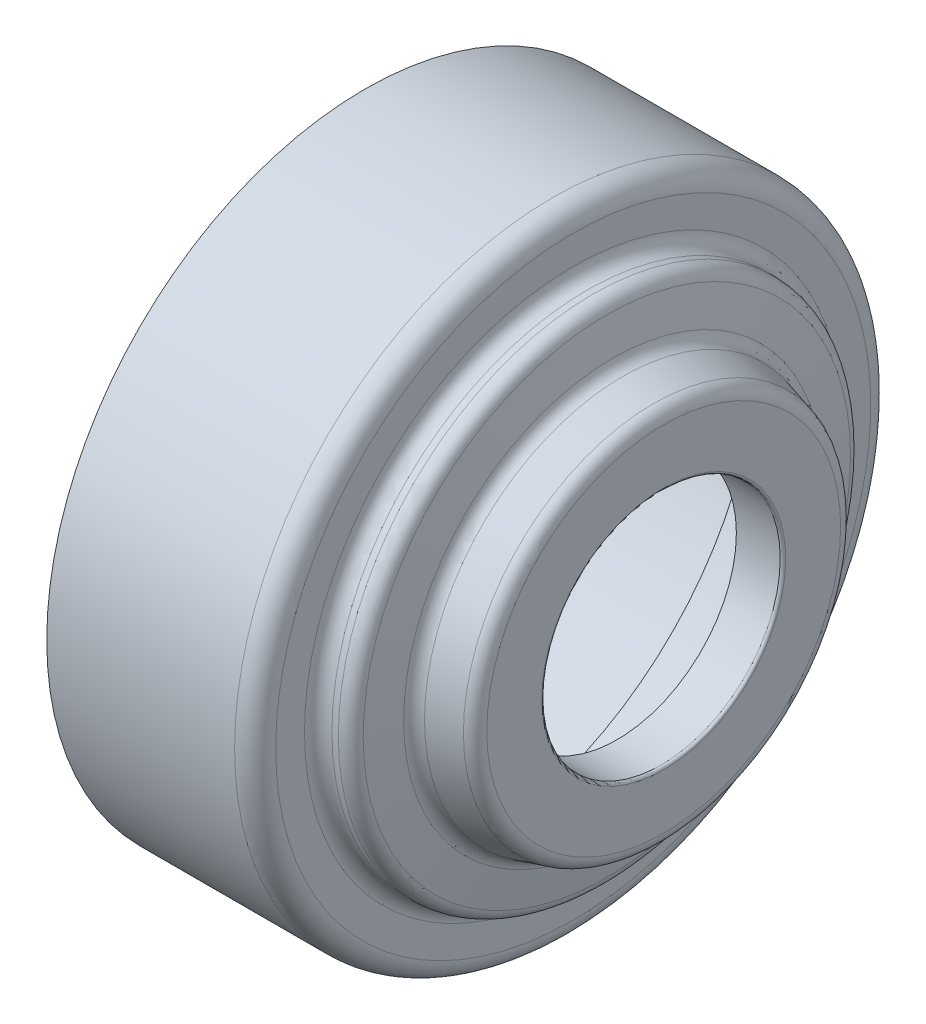
ISO-10303-21;
HEADER;
FILE_DESCRIPTION(('STEP AP214'),'2;1');
FILE_NAME('part.step','',(''),(''),'','','');
FILE_SCHEMA(('AUTOMOTIVE_DESIGN { 1 0 10303 214 1 1 1 1 }'));
ENDSEC;
DATA;
#1=APPLICATION_CONTEXT('core data for automotive mechanical design processes');
#2=APPLICATION_PROTOCOL_DEFINITION('international standard','automotive_design',2000,#1);
#3=PRODUCT_CONTEXT('',#1,'mechanical');
#4=PRODUCT('Part','Part','',(#3));
#5=PRODUCT_RELATED_PRODUCT_CATEGORY('part','',(#4));
#6=PRODUCT_DEFINITION_FORMATION('','',#4);
#7=PRODUCT_DEFINITION_CONTEXT('part definition',#1,'design');
#8=PRODUCT_DEFINITION('design','',#6,#7);
#9=PRODUCT_DEFINITION_SHAPE('','',#8);
#10=(LENGTH_UNIT() NAMED_UNIT(*) SI_UNIT(.MILLI.,.METRE.));
#11=(NAMED_UNIT(*) PLANE_ANGLE_UNIT() SI_UNIT($,.RADIAN.));
#12=(NAMED_UNIT(*) SI_UNIT($,.STERADIAN.) SOLID_ANGLE_UNIT());
#13=UNCERTAINTY_MEASURE_WITH_UNIT(LENGTH_MEASURE(1.E-05),#10,'distance_accuracy_value','');
#14=(GEOMETRIC_REPRESENTATION_CONTEXT(3) GLOBAL_UNCERTAINTY_ASSIGNED_CONTEXT((#13)) GLOBAL_UNIT_ASSIGNED_CONTEXT((#10,
#11,#12)) REPRESENTATION_CONTEXT('',''));
#15=CARTESIAN_POINT('',(0.,0.,0.));
#16=DIRECTION('',(0.,0.,1.));
#17=DIRECTION('',(1.,0.,0.));
#18=AXIS2_PLACEMENT_3D('',#15,#16,#17);
#19=CARTESIAN_POINT('',(-14.,22.,0.));
#20=DIRECTION('',(1.,0.,0.));
#21=DIRECTION('',(0.,0.,-1.));
#22=AXIS2_PLACEMENT_3D('',#19,#20,#21);
#23=PLANE('',#22);
#24=CARTESIAN_POINT('',(-14.,0.,0.));
#25=DIRECTION('',(-1.,0.,0.));
#26=DIRECTION('',(0.,0.,1.));
#27=AXIS2_PLACEMENT_3D('',#24,#25,#26);
#28=CIRCLE('',#27,22.);
#29=CARTESIAN_POINT('',(-14.,0.,22.));
#30=VERTEX_POINT('',#29);
#31=EDGE_CURVE('E127',#30,#30,#28,.T.);
#32=ORIENTED_EDGE('',*,*,#31,.F.);
#33=EDGE_LOOP('',(#32));
#34=FACE_BOUND('',#33,.T.);
#35=CARTESIAN_POINT('',(-14.,0.,0.));
#36=DIRECTION('',(-1.,0.,0.));
#37=DIRECTION('',(0.,0.,1.));
#38=AXIS2_PLACEMENT_3D('',#35,#36,#37);
#39=CIRCLE('',#38,23.2);
#40=CARTESIAN_POINT('',(-14.,0.,23.2));
#41=VERTEX_POINT('',#40);
#42=EDGE_CURVE('E109',#41,#41,#39,.T.);
#43=ORIENTED_EDGE('',*,*,#42,.T.);
#44=EDGE_LOOP('',(#43));
#45=FACE_BOUND('',#44,.T.);
#46=ADVANCED_FACE('F35',(#34,#45),#23,.F.);
#47=CARTESIAN_POINT('',(-36.9366053169734,0.,0.));
#48=DIRECTION('',(-1.,0.,0.));
#49=DIRECTION('',(0.,0.,1.));
#50=AXIS2_PLACEMENT_3D('',#47,#48,#49);
#51=CYLINDRICAL_SURFACE('',#50,23.2);
#52=CARTESIAN_POINT('',(-0.300000000000002,0.,0.));
#53=DIRECTION('',(-1.,0.,0.));
#54=DIRECTION('',(0.,0.,1.));
#55=AXIS2_PLACEMENT_3D('',#52,#53,#54);
#56=CIRCLE('',#55,23.2);
#57=CARTESIAN_POINT('',(-0.300000000000002,0.,23.2));
#58=VERTEX_POINT('',#57);
#59=EDGE_CURVE('E50',#58,#58,#56,.T.);
#60=ORIENTED_EDGE('',*,*,#59,.T.);
#61=EDGE_LOOP('',(#60));
#62=FACE_BOUND('',#61,.T.);
#63=ORIENTED_EDGE('',*,*,#42,.F.);
#64=EDGE_LOOP('',(#63));
#65=FACE_BOUND('',#64,.T.);
#66=ADVANCED_FACE('F135',(#62,#65),#51,.T.);
#67=CARTESIAN_POINT('',(1.2,23.2,0.));
#68=DIRECTION('',(-1.,0.,0.));
#69=DIRECTION('',(0.,0.,1.));
#70=AXIS2_PLACEMENT_3D('',#67,#68,#69);
#71=PLANE('',#70);
#72=CARTESIAN_POINT('',(1.2,0.,0.));
#73=DIRECTION('',(-1.,0.,0.));
#74=DIRECTION('',(0.,0.,1.));
#75=AXIS2_PLACEMENT_3D('',#72,#73,#74);
#76=CIRCLE('',#75,21.7);
#77=CARTESIAN_POINT('',(1.2,0.,21.7));
#78=VERTEX_POINT('',#77);
#79=EDGE_CURVE('E46',#78,#78,#76,.F.);
#80=ORIENTED_EDGE('',*,*,#79,.T.);
#81=EDGE_LOOP('',(#80));
#82=FACE_BOUND('',#81,.T.);
#83=CARTESIAN_POINT('',(1.2,0.,0.));
#84=DIRECTION('',(-1.,0.,0.));
#85=DIRECTION('',(0.,0.,1.));
#86=AXIS2_PLACEMENT_3D('',#83,#84,#85);
#87=CIRCLE('',#86,19.6);
#88=CARTESIAN_POINT('',(1.2,0.,19.6));
#89=VERTEX_POINT('',#88);
#90=EDGE_CURVE('E67',#89,#89,#87,.T.);
#91=ORIENTED_EDGE('',*,*,#90,.T.);
#92=EDGE_LOOP('',(#91));
#93=FACE_BOUND('',#92,.T.);
#94=ADVANCED_FACE('F140',(#82,#93),#71,.F.);
#95=CARTESIAN_POINT('',(-36.9366053169734,0.,0.));
#96=DIRECTION('',(-1.,0.,0.));
#97=DIRECTION('',(0.,0.,1.));
#98=AXIS2_PLACEMENT_3D('',#95,#96,#97);
#99=CYLINDRICAL_SURFACE('',#98,18.6);
#100=CARTESIAN_POINT('',(2.2,0.,0.));
#101=DIRECTION('',(-1.,0.,0.));
#102=DIRECTION('',(0.,0.,1.));
#103=AXIS2_PLACEMENT_3D('',#100,#101,#102);
#104=CIRCLE('',#103,18.6);
#105=CARTESIAN_POINT('',(2.2,0.,18.6));
#106=VERTEX_POINT('',#105);
#107=EDGE_CURVE('E61',#106,#106,#104,.F.);
#108=ORIENTED_EDGE('',*,*,#107,.T.);
#109=EDGE_LOOP('',(#108));
#110=FACE_BOUND('',#109,.T.);
#111=CARTESIAN_POINT('',(2.66781992623546,0.,0.));
#112=DIRECTION('',(1.,0.,0.));
#113=DIRECTION('',(0.,0.,-1.));
#114=AXIS2_PLACEMENT_3D('',#111,#112,#113);
#115=CIRCLE('',#114,18.6);
#116=CARTESIAN_POINT('',(2.66781992623546,0.,-18.6));
#117=VERTEX_POINT('',#116);
#118=EDGE_CURVE('E64',#117,#117,#115,.F.);
#119=ORIENTED_EDGE('',*,*,#118,.T.);
#120=EDGE_LOOP('',(#119));
#121=FACE_BOUND('',#120,.T.);
#122=ADVANCED_FACE('F146',(#110,#121),#99,.T.);
#123=CARTESIAN_POINT('',(4.20628056986992,0.,0.));
#124=DIRECTION('',(-1.,0.,0.));
#125=DIRECTION('',(0.,0.,1.));
#126=AXIS2_PLACEMENT_3D('',#123,#124,#125);
#127=CONICAL_SURFACE('',#126,14.6337266047022,1.39626340159546);
#128=CARTESIAN_POINT('',(3.65262767924767,0.,0.));
#129=DIRECTION('',(1.,0.,0.));
#130=DIRECTION('',(0.,0.,-1.));
#131=AXIS2_PLACEMENT_3D('',#128,#129,#130);
#132=CIRCLE('',#131,17.7736481776669);
#133=CARTESIAN_POINT('',(3.65262767924767,0.,-17.7736481776669));
#134=VERTEX_POINT('',#133);
#135=EDGE_CURVE('E55',#134,#134,#132,.T.);
#136=ORIENTED_EDGE('',*,*,#135,.T.);
#137=EDGE_LOOP('',(#136));
#138=FACE_BOUND('',#137,.T.);
#139=CARTESIAN_POINT('',(4.0956544800349,0.,0.));
#140=DIRECTION('',(-1.,0.,0.));
#141=DIRECTION('',(0.,0.,1.));
#142=AXIS2_PLACEMENT_3D('',#139,#140,#141);
#143=CIRCLE('',#142,15.2611183367589);
#144=CARTESIAN_POINT('',(4.0956544800349,0.,15.2611183367589));
#145=VERTEX_POINT('',#144);
#146=EDGE_CURVE('E58',#145,#145,#143,.T.);
#147=ORIENTED_EDGE('',*,*,#146,.T.);
#148=EDGE_LOOP('',(#147));
#149=FACE_BOUND('',#148,.T.);
#150=ADVANCED_FACE('F291',(#138,#149),#127,.T.);
#151=CARTESIAN_POINT('',(7.8,0.,0.));
#152=DIRECTION('',(-1.,0.,0.));
#153=DIRECTION('',(0.,0.,1.));
#154=AXIS2_PLACEMENT_3D('',#151,#152,#153);
#155=CONICAL_SURFACE('',#154,13.6707923855747,0.261799387799154);
#156=CARTESIAN_POINT('',(7.05881904510253,0.,0.));
#157=DIRECTION('',(1.,0.,0.));
#158=DIRECTION('',(0.,0.,-1.));
#159=AXIS2_PLACEMENT_3D('',#156,#157,#158);
#160=CIRCLE('',#159,13.8693912238849);
#161=CARTESIAN_POINT('',(7.05881904510253,0.,-13.8693912238849));
#162=VERTEX_POINT('',#161);
#163=EDGE_CURVE('E73',#162,#162,#160,.F.);
#164=ORIENTED_EDGE('',*,*,#163,.T.);
#165=EDGE_LOOP('',(#164));
#166=FACE_BOUND('',#165,.T.);
#167=CARTESIAN_POINT('',(4.82164318794459,0.,0.));
#168=DIRECTION('',(-1.,0.,0.));
#169=DIRECTION('',(0.,0.,1.));
#170=AXIS2_PLACEMENT_3D('',#167,#168,#169);
#171=CIRCLE('',#170,14.4688406881367);
#172=CARTESIAN_POINT('',(4.82164318794459,0.,14.4688406881367));
#173=VERTEX_POINT('',#172);
#174=EDGE_CURVE('E76',#173,#173,#171,.F.);
#175=ORIENTED_EDGE('',*,*,#174,.T.);
#176=EDGE_LOOP('',(#175));
#177=FACE_BOUND('',#176,.T.);
#178=ADVANCED_FACE('F279',(#166,#177),#155,.T.);
#179=CARTESIAN_POINT('',(7.8,13.6707923855747,0.));
#180=DIRECTION('',(-1.,0.,0.));
#181=DIRECTION('',(0.,0.,1.));
#182=AXIS2_PLACEMENT_3D('',#179,#180,#181);
#183=PLANE('',#182);
#184=CARTESIAN_POINT('',(7.8,0.,0.));
#185=DIRECTION('',(-1.,0.,0.));
#186=DIRECTION('',(0.,0.,1.));
#187=AXIS2_PLACEMENT_3D('',#184,#185,#186);
#188=CIRCLE('',#187,12.9034653975958);
#189=CARTESIAN_POINT('',(7.8,0.,12.9034653975958));
#190=VERTEX_POINT('',#189);
#191=EDGE_CURVE('E70',#190,#190,#188,.F.);
#192=ORIENTED_EDGE('',*,*,#191,.T.);
#193=EDGE_LOOP('',(#192));
#194=FACE_BOUND('',#193,.T.);
#195=CARTESIAN_POINT('',(7.8,0.,0.));
#196=DIRECTION('',(-1.,0.,0.));
#197=DIRECTION('',(0.,0.,1.));
#198=AXIS2_PLACEMENT_3D('',#195,#196,#197);
#199=CIRCLE('',#198,8.9);
#200=CARTESIAN_POINT('',(7.8,0.,8.9));
#201=VERTEX_POINT('',#200);
#202=EDGE_CURVE('E100',#201,#201,#199,.T.);
#203=ORIENTED_EDGE('',*,*,#202,.T.);
#204=EDGE_LOOP('',(#203));
#205=FACE_BOUND('',#204,.T.);
#206=ADVANCED_FACE('F273',(#194,#205),#183,.F.);
#207=CARTESIAN_POINT('',(-36.9366053169734,0.,0.));
#208=DIRECTION('',(-1.,0.,0.));
#209=DIRECTION('',(0.,0.,1.));
#210=AXIS2_PLACEMENT_3D('',#207,#208,#209);
#211=CYLINDRICAL_SURFACE('',#210,8.7);
#212=CARTESIAN_POINT('',(7.6,0.,0.));
#213=DIRECTION('',(-1.,0.,0.));
#214=DIRECTION('',(0.,0.,1.));
#215=AXIS2_PLACEMENT_3D('',#212,#213,#214);
#216=CIRCLE('',#215,8.7);
#217=CARTESIAN_POINT('',(7.6,0.,8.7));
#218=VERTEX_POINT('',#217);
#219=EDGE_CURVE('E97',#218,#218,#216,.F.);
#220=ORIENTED_EDGE('',*,*,#219,.T.);
#221=EDGE_LOOP('',(#220));
#222=FACE_BOUND('',#221,.T.);
#223=CARTESIAN_POINT('',(4.4,0.,0.));
#224=DIRECTION('',(-1.,0.,0.));
#225=DIRECTION('',(0.,0.,1.));
#226=AXIS2_PLACEMENT_3D('',#223,#224,#225);
#227=CIRCLE('',#226,8.7);
#228=CARTESIAN_POINT('',(4.4,0.,8.7));
#229=VERTEX_POINT('',#228);
#230=EDGE_CURVE('E112',#229,#229,#227,.T.);
#231=ORIENTED_EDGE('',*,*,#230,.T.);
#232=EDGE_LOOP('',(#231));
#233=FACE_BOUND('',#232,.T.);
#234=ADVANCED_FACE('F278',(#222,#233),#211,.F.);
#235=CARTESIAN_POINT('',(4.4,9.4,0.));
#236=DIRECTION('',(1.,0.,0.));
#237=DIRECTION('',(0.,0.,-1.));
#238=AXIS2_PLACEMENT_3D('',#235,#236,#237);
#239=PLANE('',#238);
#240=ORIENTED_EDGE('',*,*,#230,.F.);
#241=EDGE_LOOP('',(#240));
#242=FACE_BOUND('',#241,.T.);
#243=CARTESIAN_POINT('',(4.4,0.,0.));
#244=DIRECTION('',(-1.,0.,0.));
#245=DIRECTION('',(0.,0.,1.));
#246=AXIS2_PLACEMENT_3D('',#243,#244,#245);
#247=CIRCLE('',#246,9.4);
#248=CARTESIAN_POINT('',(4.4,0.,9.4));
#249=VERTEX_POINT('',#248);
#250=EDGE_CURVE('E115',#249,#249,#247,.T.);
#251=ORIENTED_EDGE('',*,*,#250,.T.);
#252=EDGE_LOOP('',(#251));
#253=FACE_BOUND('',#252,.T.);
#254=ADVANCED_FACE('F385',(#242,#253),#239,.F.);
#255=CARTESIAN_POINT('',(-36.9366053169734,0.,0.));
#256=DIRECTION('',(-1.,0.,0.));
#257=DIRECTION('',(0.,0.,1.));
#258=AXIS2_PLACEMENT_3D('',#255,#256,#257);
#259=CYLINDRICAL_SURFACE('',#258,9.4);
#260=ORIENTED_EDGE('',*,*,#250,.F.);
#261=EDGE_LOOP('',(#260));
#262=FACE_BOUND('',#261,.T.);
#263=CARTESIAN_POINT('',(6.6,0.,0.));
#264=DIRECTION('',(-1.,0.,0.));
#265=DIRECTION('',(0.,0.,1.));
#266=AXIS2_PLACEMENT_3D('',#263,#264,#265);
#267=CIRCLE('',#266,9.4);
#268=CARTESIAN_POINT('',(6.6,0.,9.4));
#269=VERTEX_POINT('',#268);
#270=EDGE_CURVE('E118',#269,#269,#267,.T.);
#271=ORIENTED_EDGE('',*,*,#270,.T.);
#272=EDGE_LOOP('',(#271));
#273=FACE_BOUND('',#272,.T.);
#274=ADVANCED_FACE('F375',(#262,#273),#259,.T.);
#275=CARTESIAN_POINT('',(6.6,12.75,0.));
#276=DIRECTION('',(1.,0.,0.));
#277=DIRECTION('',(0.,0.,-1.));
#278=AXIS2_PLACEMENT_3D('',#275,#276,#277);
#279=PLANE('',#278);
#280=CARTESIAN_POINT('',(6.6,0.,0.));
#281=DIRECTION('',(1.,0.,0.));
#282=DIRECTION('',(0.,0.,-1.));
#283=AXIS2_PLACEMENT_3D('',#280,#281,#282);
#284=CIRCLE('',#283,12.5965346024042);
#285=CARTESIAN_POINT('',(6.6,0.,-12.5965346024042));
#286=VERTEX_POINT('',#285);
#287=EDGE_CURVE('E106',#286,#286,#284,.F.);
#288=ORIENTED_EDGE('',*,*,#287,.T.);
#289=EDGE_LOOP('',(#288));
#290=FACE_BOUND('',#289,.T.);
#291=ORIENTED_EDGE('',*,*,#270,.F.);
#292=EDGE_LOOP('',(#291));
#293=FACE_BOUND('',#292,.T.);
#294=ADVANCED_FACE('F229',(#290,#293),#279,.F.);
#295=CARTESIAN_POINT('',(3.1572625740573,0.,0.));
#296=DIRECTION('',(-1.,0.,0.));
#297=DIRECTION('',(0.,0.,1.));
#298=AXIS2_PLACEMENT_3D('',#295,#296,#297);
#299=CONICAL_SURFACE('',#298,13.6724787130338,0.261799387799153);
#300=CARTESIAN_POINT('',(4.0803065011693,0.,0.));
#301=DIRECTION('',(1.,0.,0.));
#302=DIRECTION('',(0.,0.,-1.));
#303=AXIS2_PLACEMENT_3D('',#300,#301,#302);
#304=CIRCLE('',#303,13.4251498381856);
#305=CARTESIAN_POINT('',(4.0803065011693,0.,-13.4251498381856));
#306=VERTEX_POINT('',#305);
#307=EDGE_CURVE('E42',#306,#306,#304,.F.);
#308=ORIENTED_EDGE('',*,*,#307,.T.);
#309=EDGE_LOOP('',(#308));
#310=FACE_BOUND('',#309,.T.);
#311=CARTESIAN_POINT('',(6.45176380902051,0.,0.));
#312=DIRECTION('',(-1.,0.,0.));
#313=DIRECTION('',(0.,0.,1.));
#314=AXIS2_PLACEMENT_3D('',#311,#312,#313);
#315=CIRCLE('',#314,12.789719767662);
#316=CARTESIAN_POINT('',(6.45176380902051,0.,12.789719767662));
#317=VERTEX_POINT('',#316);
#318=EDGE_CURVE('E103',#317,#317,#315,.F.);
#319=ORIENTED_EDGE('',*,*,#318,.T.);
#320=EDGE_LOOP('',(#319));
#321=FACE_BOUND('',#320,.T.);
#322=ADVANCED_FACE('F218',(#310,#321),#299,.F.);
#323=CARTESIAN_POINT('',(2.5,0.,0.));
#324=DIRECTION('',(-1.,0.,0.));
#325=DIRECTION('',(0.,0.,1.));
#326=AXIS2_PLACEMENT_3D('',#323,#324,#325);
#327=CONICAL_SURFACE('',#326,17.4,1.39626340159546);
#328=CARTESIAN_POINT('',(2.99132343930477,0.,0.));
#329=DIRECTION('',(1.,0.,0.));
#330=DIRECTION('',(0.,0.,-1.));
#331=AXIS2_PLACEMENT_3D('',#328,#329,#330);
#332=CIRCLE('',#331,14.6135663111189);
#333=CARTESIAN_POINT('',(2.99132343930477,0.,-14.6135663111189));
#334=VERTEX_POINT('',#333);
#335=EDGE_CURVE('E10',#334,#334,#332,.T.);
#336=ORIENTED_EDGE('',*,*,#335,.T.);
#337=EDGE_LOOP('',(#336));
#338=FACE_BOUND('',#337,.T.);
#339=CARTESIAN_POINT('',(2.52914162436699,0.,0.));
#340=DIRECTION('',(-1.,0.,0.));
#341=DIRECTION('',(0.,0.,1.));
#342=AXIS2_PLACEMENT_3D('',#339,#340,#341);
#343=CIRCLE('',#342,17.2347296355334);
#344=CARTESIAN_POINT('',(2.52914162436699,0.,17.2347296355334));
#345=VERTEX_POINT('',#344);
#346=EDGE_CURVE('E94',#345,#345,#343,.T.);
#347=ORIENTED_EDGE('',*,*,#346,.T.);
#348=EDGE_LOOP('',(#347));
#349=FACE_BOUND('',#348,.T.);
#350=ADVANCED_FACE('F212',(#338,#349),#327,.F.);
#351=CARTESIAN_POINT('',(-36.9366053169734,0.,0.));
#352=DIRECTION('',(-1.,0.,0.));
#353=DIRECTION('',(0.,0.,1.));
#354=AXIS2_PLACEMENT_3D('',#351,#352,#353);
#355=CYLINDRICAL_SURFACE('',#354,17.4);
#356=CARTESIAN_POINT('',(2.33218007376455,0.,0.));
#357=DIRECTION('',(-1.,0.,0.));
#358=DIRECTION('',(0.,0.,1.));
#359=AXIS2_PLACEMENT_3D('',#356,#357,#358);
#360=CIRCLE('',#359,17.4);
#361=CARTESIAN_POINT('',(2.33218007376455,0.,17.4));
#362=VERTEX_POINT('',#361);
#363=EDGE_CURVE('E88',#362,#362,#360,.F.);
#364=ORIENTED_EDGE('',*,*,#363,.T.);
#365=EDGE_LOOP('',(#364));
#366=FACE_BOUND('',#365,.T.);
#367=CARTESIAN_POINT('',(0.199999999999999,0.,0.));
#368=DIRECTION('',(1.,0.,0.));
#369=DIRECTION('',(0.,0.,-1.));
#370=AXIS2_PLACEMENT_3D('',#367,#368,#369);
#371=CIRCLE('',#370,17.4);
#372=CARTESIAN_POINT('',(0.199999999999999,0.,-17.4));
#373=VERTEX_POINT('',#372);
#374=EDGE_CURVE('E91',#373,#373,#371,.F.);
#375=ORIENTED_EDGE('',*,*,#374,.T.);
#376=EDGE_LOOP('',(#375));
#377=FACE_BOUND('',#376,.T.);
#378=ADVANCED_FACE('F217',(#366,#377),#355,.F.);
#379=CARTESIAN_POINT('',(0.,21.6,0.));
#380=DIRECTION('',(1.,0.,0.));
#381=DIRECTION('',(0.,0.,-1.));
#382=AXIS2_PLACEMENT_3D('',#379,#380,#381);
#383=PLANE('',#382);
#384=CARTESIAN_POINT('',(0.,0.,0.));
#385=DIRECTION('',(1.,0.,0.));
#386=DIRECTION('',(0.,0.,-1.));
#387=AXIS2_PLACEMENT_3D('',#384,#385,#386);
#388=CIRCLE('',#387,21.4);
#389=CARTESIAN_POINT('',(0.,0.,-21.4));
#390=VERTEX_POINT('',#389);
#391=EDGE_CURVE('E82',#390,#390,#388,.F.);
#392=ORIENTED_EDGE('',*,*,#391,.T.);
#393=EDGE_LOOP('',(#392));
#394=FACE_BOUND('',#393,.T.);
#395=CARTESIAN_POINT('',(0.,0.,0.));
#396=DIRECTION('',(1.,0.,0.));
#397=DIRECTION('',(0.,0.,-1.));
#398=AXIS2_PLACEMENT_3D('',#395,#396,#397);
#399=CIRCLE('',#398,17.6);
#400=CARTESIAN_POINT('',(0.,0.,-17.6));
#401=VERTEX_POINT('',#400);
#402=EDGE_CURVE('E85',#401,#401,#399,.T.);
#403=ORIENTED_EDGE('',*,*,#402,.T.);
#404=EDGE_LOOP('',(#403));
#405=FACE_BOUND('',#404,.T.);
#406=ADVANCED_FACE('F349',(#394,#405),#383,.F.);
#407=CARTESIAN_POINT('',(-36.9366053169734,0.,0.));
#408=DIRECTION('',(-1.,0.,0.));
#409=DIRECTION('',(0.,0.,1.));
#410=AXIS2_PLACEMENT_3D('',#407,#408,#409);
#411=CYLINDRICAL_SURFACE('',#410,21.6);
#412=CARTESIAN_POINT('',(-0.199999999999999,0.,0.));
#413=DIRECTION('',(1.,0.,0.));
#414=DIRECTION('',(0.,0.,-1.));
#415=AXIS2_PLACEMENT_3D('',#412,#413,#414);
#416=CIRCLE('',#415,21.6);
#417=CARTESIAN_POINT('',(-0.199999999999999,0.,-21.6));
#418=VERTEX_POINT('',#417);
#419=EDGE_CURVE('E79',#418,#418,#416,.T.);
#420=ORIENTED_EDGE('',*,*,#419,.T.);
#421=EDGE_LOOP('',(#420));
#422=FACE_BOUND('',#421,.T.);
#423=CARTESIAN_POINT('',(-6.9,0.,0.));
#424=DIRECTION('',(-1.,0.,0.));
#425=DIRECTION('',(0.,0.,1.));
#426=AXIS2_PLACEMENT_3D('',#423,#424,#425);
#427=CIRCLE('',#426,21.6);
#428=CARTESIAN_POINT('',(-6.9,0.,21.6));
#429=VERTEX_POINT('',#428);
#430=EDGE_CURVE('E121',#429,#429,#427,.T.);
#431=ORIENTED_EDGE('',*,*,#430,.T.);
#432=EDGE_LOOP('',(#431));
#433=FACE_BOUND('',#432,.T.);
#434=ADVANCED_FACE('F343',(#422,#433),#411,.F.);
#435=CARTESIAN_POINT('',(-6.9,22.,0.));
#436=DIRECTION('',(1.,0.,0.));
#437=DIRECTION('',(0.,0.,-1.));
#438=AXIS2_PLACEMENT_3D('',#435,#436,#437);
#439=PLANE('',#438);
#440=ORIENTED_EDGE('',*,*,#430,.F.);
#441=EDGE_LOOP('',(#440));
#442=FACE_BOUND('',#441,.T.);
#443=CARTESIAN_POINT('',(-6.9,0.,0.));
#444=DIRECTION('',(-1.,0.,0.));
#445=DIRECTION('',(0.,0.,1.));
#446=AXIS2_PLACEMENT_3D('',#443,#444,#445);
#447=CIRCLE('',#446,22.);
#448=CARTESIAN_POINT('',(-6.9,0.,22.));
#449=VERTEX_POINT('',#448);
#450=EDGE_CURVE('E124',#449,#449,#447,.T.);
#451=ORIENTED_EDGE('',*,*,#450,.T.);
#452=EDGE_LOOP('',(#451));
#453=FACE_BOUND('',#452,.T.);
#454=ADVANCED_FACE('F348',(#442,#453),#439,.F.);
#455=CARTESIAN_POINT('',(-36.9366053169734,0.,0.));
#456=DIRECTION('',(-1.,0.,0.));
#457=DIRECTION('',(0.,0.,1.));
#458=AXIS2_PLACEMENT_3D('',#455,#456,#457);
#459=CYLINDRICAL_SURFACE('',#458,22.);
#460=ORIENTED_EDGE('',*,*,#450,.F.);
#461=EDGE_LOOP('',(#460));
#462=FACE_BOUND('',#461,.T.);
#463=ORIENTED_EDGE('',*,*,#31,.T.);
#464=EDGE_LOOP('',(#463));
#465=FACE_BOUND('',#464,.T.);
#466=ADVANCED_FACE('F131',(#462,#465),#459,.F.);
#467=CARTESIAN_POINT('',(6.4,0.,0.));
#468=DIRECTION('',(1.,0.,0.));
#469=DIRECTION('',(0.,0.,-1.));
#470=AXIS2_PLACEMENT_3D('',#467,#468,#469);
#471=TOROIDAL_SURFACE('',#470,12.5965346024042,0.2);
#472=ORIENTED_EDGE('',*,*,#318,.F.);
#473=EDGE_LOOP('',(#472));
#474=FACE_BOUND('',#473,.T.);
#475=ORIENTED_EDGE('',*,*,#287,.F.);
#476=EDGE_LOOP('',(#475));
#477=FACE_BOUND('',#476,.T.);
#478=ADVANCED_FACE('F151',(#474,#477),#471,.F.);
#479=CARTESIAN_POINT('',(7.6,0.,0.));
#480=DIRECTION('',(-1.,0.,0.));
#481=DIRECTION('',(0.,0.,1.));
#482=AXIS2_PLACEMENT_3D('',#479,#480,#481);
#483=TOROIDAL_SURFACE('',#482,8.9,0.2);
#484=ORIENTED_EDGE('',*,*,#219,.F.);
#485=EDGE_LOOP('',(#484));
#486=FACE_BOUND('',#485,.T.);
#487=ORIENTED_EDGE('',*,*,#202,.F.);
#488=EDGE_LOOP('',(#487));
#489=FACE_BOUND('',#488,.T.);
#490=ADVANCED_FACE('F154',(#486,#489),#483,.T.);
#491=CARTESIAN_POINT('',(2.33218007376455,0.,0.));
#492=DIRECTION('',(-1.,0.,0.));
#493=DIRECTION('',(0.,0.,1.));
#494=AXIS2_PLACEMENT_3D('',#491,#492,#493);
#495=TOROIDAL_SURFACE('',#494,17.2,0.2);
#496=ORIENTED_EDGE('',*,*,#363,.F.);
#497=EDGE_LOOP('',(#496));
#498=FACE_BOUND('',#497,.T.);
#499=ORIENTED_EDGE('',*,*,#346,.F.);
#500=EDGE_LOOP('',(#499));
#501=FACE_BOUND('',#500,.T.);
#502=ADVANCED_FACE('F158',(#498,#501),#495,.F.);
#503=CARTESIAN_POINT('',(-0.199999999999999,0.,0.));
#504=DIRECTION('',(1.,0.,0.));
#505=DIRECTION('',(0.,0.,-1.));
#506=AXIS2_PLACEMENT_3D('',#503,#504,#505);
#507=TOROIDAL_SURFACE('',#506,21.4,0.2);
#508=ORIENTED_EDGE('',*,*,#419,.F.);
#509=EDGE_LOOP('',(#508));
#510=FACE_BOUND('',#509,.T.);
#511=ORIENTED_EDGE('',*,*,#391,.F.);
#512=EDGE_LOOP('',(#511));
#513=FACE_BOUND('',#512,.T.);
#514=ADVANCED_FACE('F162',(#510,#513),#507,.F.);
#515=CARTESIAN_POINT('',(0.199999999999999,0.,0.));
#516=DIRECTION('',(1.,0.,0.));
#517=DIRECTION('',(0.,0.,-1.));
#518=AXIS2_PLACEMENT_3D('',#515,#516,#517);
#519=TOROIDAL_SURFACE('',#518,17.6,0.2);
#520=ORIENTED_EDGE('',*,*,#402,.F.);
#521=EDGE_LOOP('',(#520));
#522=FACE_BOUND('',#521,.T.);
#523=ORIENTED_EDGE('',*,*,#374,.F.);
#524=EDGE_LOOP('',(#523));
#525=FACE_BOUND('',#524,.T.);
#526=ADVANCED_FACE('F166',(#522,#525),#519,.T.);
#527=CARTESIAN_POINT('',(6.8,0.,0.));
#528=DIRECTION('',(-1.,0.,0.));
#529=DIRECTION('',(0.,0.,1.));
#530=AXIS2_PLACEMENT_3D('',#527,#528,#529);
#531=TOROIDAL_SURFACE('',#530,12.9034653975958,1.);
#532=ORIENTED_EDGE('',*,*,#191,.F.);
#533=EDGE_LOOP('',(#532));
#534=FACE_BOUND('',#533,.T.);
#535=ORIENTED_EDGE('',*,*,#163,.F.);
#536=EDGE_LOOP('',(#535));
#537=FACE_BOUND('',#536,.T.);
#538=ADVANCED_FACE('F170',(#534,#537),#531,.T.);
#539=CARTESIAN_POINT('',(2.2,0.,0.));
#540=DIRECTION('',(-1.,0.,0.));
#541=DIRECTION('',(0.,0.,1.));
#542=AXIS2_PLACEMENT_3D('',#539,#540,#541);
#543=TOROIDAL_SURFACE('',#542,19.6,1.);
#544=ORIENTED_EDGE('',*,*,#107,.F.);
#545=EDGE_LOOP('',(#544));
#546=FACE_BOUND('',#545,.T.);
#547=ORIENTED_EDGE('',*,*,#90,.F.);
#548=EDGE_LOOP('',(#547));
#549=FACE_BOUND('',#548,.T.);
#550=ADVANCED_FACE('F174',(#546,#549),#543,.F.);
#551=CARTESIAN_POINT('',(2.66781992623546,0.,0.));
#552=DIRECTION('',(1.,0.,0.));
#553=DIRECTION('',(0.,0.,-1.));
#554=AXIS2_PLACEMENT_3D('',#551,#552,#553);
#555=TOROIDAL_SURFACE('',#554,17.6,1.);
#556=ORIENTED_EDGE('',*,*,#135,.F.);
#557=EDGE_LOOP('',(#556));
#558=FACE_BOUND('',#557,.T.);
#559=ORIENTED_EDGE('',*,*,#118,.F.);
#560=EDGE_LOOP('',(#559));
#561=FACE_BOUND('',#560,.T.);
#562=ADVANCED_FACE('F178',(#558,#561),#555,.T.);
#563=CARTESIAN_POINT('',(5.08046223304711,0.,0.));
#564=DIRECTION('',(-1.,0.,0.));
#565=DIRECTION('',(0.,0.,1.));
#566=AXIS2_PLACEMENT_3D('',#563,#564,#565);
#567=TOROIDAL_SURFACE('',#566,15.4347665144258,1.);
#568=ORIENTED_EDGE('',*,*,#174,.F.);
#569=EDGE_LOOP('',(#568));
#570=FACE_BOUND('',#569,.T.);
#571=ORIENTED_EDGE('',*,*,#146,.F.);
#572=EDGE_LOOP('',(#571));
#573=FACE_BOUND('',#572,.T.);
#574=ADVANCED_FACE('F182',(#570,#573),#567,.F.);
#575=CARTESIAN_POINT('',(-0.300000000000002,0.,0.));
#576=DIRECTION('',(-1.,0.,0.));
#577=DIRECTION('',(0.,0.,1.));
#578=AXIS2_PLACEMENT_3D('',#575,#576,#577);
#579=TOROIDAL_SURFACE('',#578,21.7,1.5);
#580=ORIENTED_EDGE('',*,*,#79,.F.);
#581=EDGE_LOOP('',(#580));
#582=FACE_BOUND('',#581,.T.);
#583=ORIENTED_EDGE('',*,*,#59,.F.);
#584=EDGE_LOOP('',(#583));
#585=FACE_BOUND('',#584,.T.);
#586=ADVANCED_FACE('F185',(#582,#585),#579,.T.);
#587=CARTESIAN_POINT('',(4.46853506882308,0.,0.));
#588=DIRECTION('',(1.,0.,0.));
#589=DIRECTION('',(0.,0.,-1.));
#590=AXIS2_PLACEMENT_3D('',#587,#588,#589);
#591=TOROIDAL_SURFACE('',#590,14.8740385776193,1.5);
#592=ORIENTED_EDGE('',*,*,#335,.F.);
#593=EDGE_LOOP('',(#592));
#594=FACE_BOUND('',#593,.T.);
#595=ORIENTED_EDGE('',*,*,#307,.F.);
#596=EDGE_LOOP('',(#595));
#597=FACE_BOUND('',#596,.T.);
#598=ADVANCED_FACE('F37',(#594,#597),#591,.T.);
#599=CLOSED_SHELL('',(#46,#66,#94,#122,#150,#178,#206,#234,#254,#274,#294,#322,#350,#378,#406,
#434,#454,#466,#478,#490,#502,#514,#526,#538,#550,#562,#574,#586,#598));
#600=MANIFOLD_SOLID_BREP('B2',#599);
#601=ADVANCED_BREP_SHAPE_REPRESENTATION('',(#18,#600),#14);
#602=SHAPE_DEFINITION_REPRESENTATION(#9,#601);
ENDSEC;
END-ISO-10303-21;
